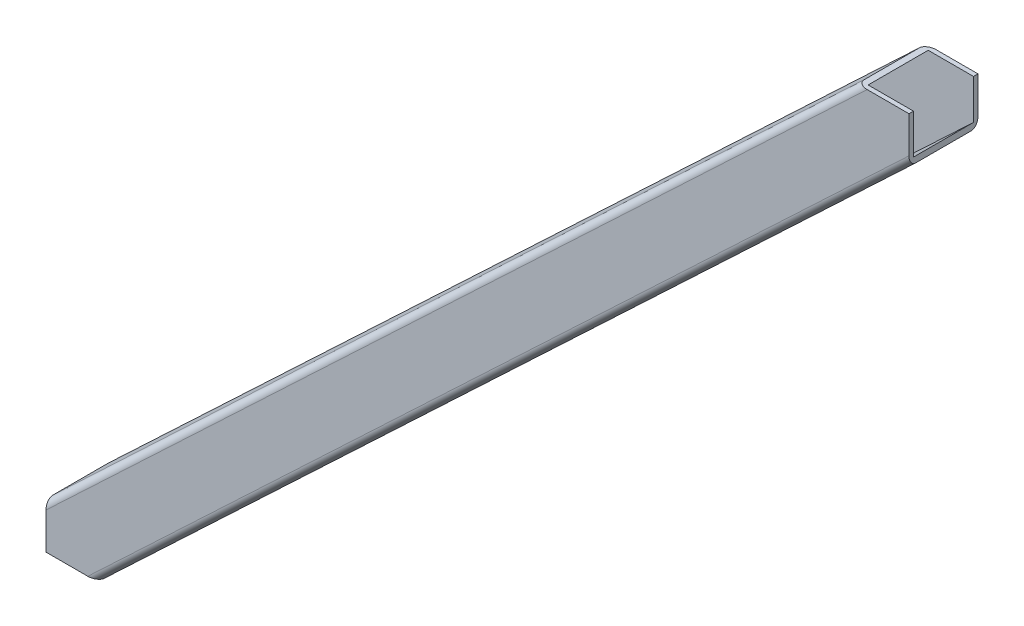
ISO-10303-21;
HEADER;
FILE_DESCRIPTION(('STEP AP214'),'2;1');
FILE_NAME('part.step','',(''),(''),'','','');
FILE_SCHEMA(('AUTOMOTIVE_DESIGN { 1 0 10303 214 1 1 1 1 }'));
ENDSEC;
DATA;
#1=APPLICATION_CONTEXT('core data for automotive mechanical design processes');
#2=APPLICATION_PROTOCOL_DEFINITION('international standard','automotive_design',2000,#1);
#3=PRODUCT_CONTEXT('',#1,'mechanical');
#4=PRODUCT('Part','Part','',(#3));
#5=PRODUCT_RELATED_PRODUCT_CATEGORY('part','',(#4));
#6=PRODUCT_DEFINITION_FORMATION('','',#4);
#7=PRODUCT_DEFINITION_CONTEXT('part definition',#1,'design');
#8=PRODUCT_DEFINITION('design','',#6,#7);
#9=PRODUCT_DEFINITION_SHAPE('','',#8);
#10=(LENGTH_UNIT() NAMED_UNIT(*) SI_UNIT(.MILLI.,.METRE.));
#11=(NAMED_UNIT(*) PLANE_ANGLE_UNIT() SI_UNIT($,.RADIAN.));
#12=(NAMED_UNIT(*) SI_UNIT($,.STERADIAN.) SOLID_ANGLE_UNIT());
#13=UNCERTAINTY_MEASURE_WITH_UNIT(LENGTH_MEASURE(1.E-05),#10,'distance_accuracy_value','');
#14=(GEOMETRIC_REPRESENTATION_CONTEXT(3) GLOBAL_UNCERTAINTY_ASSIGNED_CONTEXT((#13)) GLOBAL_UNIT_ASSIGNED_CONTEXT((#10,
#11,#12)) REPRESENTATION_CONTEXT('',''));
#15=CARTESIAN_POINT('',(0.,0.,0.));
#16=DIRECTION('',(0.,0.,1.));
#17=DIRECTION('',(1.,0.,0.));
#18=AXIS2_PLACEMENT_3D('',#15,#16,#17);
#19=CARTESIAN_POINT('',(159.560000578424,474.43889938687,1453.261));
#20=DIRECTION('',(0.,0.,-1.));
#21=DIRECTION('',(-1.,0.,0.));
#22=AXIS2_PLACEMENT_3D('',#19,#20,#21);
#23=PLANE('',#22);
#24=DIRECTION('',(1.,0.,0.));
#25=VECTOR('',#24,1.);
#26=CARTESIAN_POINT('',(-171.45,157.226,1453.261));
#27=LINE('',#26,#25);
#28=CARTESIAN_POINT('',(-158.75,157.226,1453.261));
#29=VERTEX_POINT('',#28);
#30=CARTESIAN_POINT('',(-143.372761782674,157.226,1453.261));
#31=VERTEX_POINT('',#30);
#32=EDGE_CURVE('E186',#29,#31,#27,.T.);
#33=ORIENTED_EDGE('',*,*,#32,.T.);
#34=DIRECTION('',(-0.727393652509463,-0.686220426895719,0.));
#35=VECTOR('',#34,1.);
#36=CARTESIAN_POINT('',(175.24699953726,457.810680490504,1453.261));
#37=LINE('',#36,#35);
#38=CARTESIAN_POINT('',(158.75,442.247473379881,1453.261));
#39=VERTEX_POINT('',#38);
#40=EDGE_CURVE('E11',#31,#39,#37,.F.);
#41=ORIENTED_EDGE('',*,*,#40,.T.);
#42=DIRECTION('',(0.,-1.,0.));
#43=VECTOR('',#42,1.);
#44=CARTESIAN_POINT('',(158.75,474.43889938687,1453.261));
#45=LINE('',#44,#43);
#46=CARTESIAN_POINT('',(158.75,455.676,1453.261));
#47=VERTEX_POINT('',#46);
#48=EDGE_CURVE('E286',#47,#39,#45,.T.);
#49=ORIENTED_EDGE('',*,*,#48,.F.);
#50=DIRECTION('',(-1.,0.,0.));
#51=VECTOR('',#50,1.);
#52=CARTESIAN_POINT('',(171.45,455.676,1453.261));
#53=LINE('',#52,#51);
#54=CARTESIAN_POINT('',(143.372761782674,455.676,1453.261));
#55=VERTEX_POINT('',#54);
#56=EDGE_CURVE('E204',#47,#55,#53,.T.);
#57=ORIENTED_EDGE('',*,*,#56,.T.);
#58=DIRECTION('',(-0.727393652509463,-0.686220426895719,0.));
#59=VECTOR('',#58,1.);
#60=CARTESIAN_POINT('',(161.303000462739,472.591319509496,1453.261));
#61=LINE('',#60,#59);
#62=CARTESIAN_POINT('',(-158.75,170.654526620119,1453.261));
#63=VERTEX_POINT('',#62);
#64=EDGE_CURVE('E52',#55,#63,#61,.T.);
#65=ORIENTED_EDGE('',*,*,#64,.T.);
#66=DIRECTION('',(0.,1.,0.));
#67=VECTOR('',#66,1.);
#68=CARTESIAN_POINT('',(-158.75,474.43889938687,1453.261));
#69=LINE('',#68,#67);
#70=EDGE_CURVE('E282',#29,#63,#69,.T.);
#71=ORIENTED_EDGE('',*,*,#70,.F.);
#72=EDGE_LOOP('',(#33,#41,#49,#57,#65,#71));
#73=FACE_BOUND('',#72,.T.);
#74=ADVANCED_FACE('F43',(#73),#23,.F.);
#75=CARTESIAN_POINT('',(159.560000578424,474.43889938687,1427.861));
#76=DIRECTION('',(0.686220426895719,-0.727393652509463,0.));
#77=DIRECTION('',(0.727393652509463,0.686220426895719,0.));
#78=AXIS2_PLACEMENT_3D('',#75,#76,#77);
#79=PLANE('',#78);
#80=DIRECTION('',(0.,0.,1.));
#81=VECTOR('',#80,1.);
#82=CARTESIAN_POINT('',(139.671327228342,455.676,1427.861));
#83=LINE('',#82,#81);
#84=CARTESIAN_POINT('',(139.671327228342,455.676,1430.401));
#85=VERTEX_POINT('',#84);
#86=CARTESIAN_POINT('',(139.671327228342,455.676,1450.721));
#87=VERTEX_POINT('',#86);
#88=EDGE_CURVE('E263',#85,#87,#83,.T.);
#89=ORIENTED_EDGE('',*,*,#88,.F.);
#90=DIRECTION('',(-0.727393652509463,-0.686220426895719,0.));
#91=VECTOR('',#90,1.);
#92=CARTESIAN_POINT('',(159.560000578424,474.43889938687,1430.401));
#93=LINE('',#92,#91);
#94=CARTESIAN_POINT('',(-158.75,174.146446010998,1430.401));
#95=VERTEX_POINT('',#94);
#96=EDGE_CURVE('E317',#85,#95,#93,.T.);
#97=ORIENTED_EDGE('',*,*,#96,.T.);
#98=DIRECTION('',(0.,0.,-1.));
#99=VECTOR('',#98,1.);
#100=CARTESIAN_POINT('',(-158.75,174.146446010998,1427.861));
#101=LINE('',#100,#99);
#102=CARTESIAN_POINT('',(-158.75,174.146446010998,1450.721));
#103=VERTEX_POINT('',#102);
#104=EDGE_CURVE('E248',#103,#95,#101,.T.);
#105=ORIENTED_EDGE('',*,*,#104,.F.);
#106=DIRECTION('',(-0.727393652509463,-0.686220426895719,0.));
#107=VECTOR('',#106,1.);
#108=CARTESIAN_POINT('',(159.560000578424,474.43889938687,1450.721));
#109=LINE('',#108,#107);
#110=EDGE_CURVE('E314',#103,#87,#109,.F.);
#111=ORIENTED_EDGE('',*,*,#110,.T.);
#112=EDGE_LOOP('',(#89,#97,#105,#111));
#113=FACE_BOUND('',#112,.T.);
#114=ADVANCED_FACE('F364',(#113),#79,.F.);
#115=CARTESIAN_POINT('',(159.560000578424,474.43889938687,1427.861));
#116=DIRECTION('',(0.,0.,1.));
#117=DIRECTION('',(1.,0.,0.));
#118=AXIS2_PLACEMENT_3D('',#115,#116,#117);
#119=PLANE('',#118);
#120=DIRECTION('',(0.,1.,0.));
#121=VECTOR('',#120,1.);
#122=CARTESIAN_POINT('',(158.75,144.526,1427.861));
#123=LINE('',#122,#121);
#124=CARTESIAN_POINT('',(158.75,442.247473379881,1427.861));
#125=VERTEX_POINT('',#124);
#126=CARTESIAN_POINT('',(158.75,455.676,1427.861));
#127=VERTEX_POINT('',#126);
#128=EDGE_CURVE('E187',#125,#127,#123,.T.);
#129=ORIENTED_EDGE('',*,*,#128,.F.);
#130=DIRECTION('',(-0.727393652509463,-0.686220426895719,0.));
#131=VECTOR('',#130,1.);
#132=CARTESIAN_POINT('',(175.24699953726,457.810680490504,1427.861));
#133=LINE('',#132,#131);
#134=CARTESIAN_POINT('',(-143.372761782674,157.226,1427.861));
#135=VERTEX_POINT('',#134);
#136=EDGE_CURVE('E184',#125,#135,#133,.T.);
#137=ORIENTED_EDGE('',*,*,#136,.T.);
#138=DIRECTION('',(1.,0.,0.));
#139=VECTOR('',#138,1.);
#140=CARTESIAN_POINT('',(-171.45,157.226,1427.861));
#141=LINE('',#140,#139);
#142=CARTESIAN_POINT('',(-158.75,157.226,1427.861));
#143=VERTEX_POINT('',#142);
#144=EDGE_CURVE('E174',#143,#135,#141,.T.);
#145=ORIENTED_EDGE('',*,*,#144,.F.);
#146=DIRECTION('',(0.,-1.,0.));
#147=VECTOR('',#146,1.);
#148=CARTESIAN_POINT('',(-158.75,468.376,1427.861));
#149=LINE('',#148,#147);
#150=CARTESIAN_POINT('',(-158.75,170.654526620119,1427.861));
#151=VERTEX_POINT('',#150);
#152=EDGE_CURVE('E158',#151,#143,#149,.T.);
#153=ORIENTED_EDGE('',*,*,#152,.F.);
#154=DIRECTION('',(-0.727393652509463,-0.686220426895719,0.));
#155=VECTOR('',#154,1.);
#156=CARTESIAN_POINT('',(161.303000462739,472.591319509496,1427.861));
#157=LINE('',#156,#155);
#158=CARTESIAN_POINT('',(143.372761782674,455.676,1427.861));
#159=VERTEX_POINT('',#158);
#160=EDGE_CURVE('E290',#151,#159,#157,.F.);
#161=ORIENTED_EDGE('',*,*,#160,.T.);
#162=DIRECTION('',(-1.,0.,0.));
#163=VECTOR('',#162,1.);
#164=CARTESIAN_POINT('',(171.45,455.676,1427.861));
#165=LINE('',#164,#163);
#166=EDGE_CURVE('E200',#127,#159,#165,.T.);
#167=ORIENTED_EDGE('',*,*,#166,.F.);
#168=EDGE_LOOP('',(#129,#137,#145,#153,#161,#167));
#169=FACE_BOUND('',#168,.T.);
#170=ADVANCED_FACE('F182',(#169),#119,.F.);
#171=CARTESIAN_POINT('',(176.989999421576,455.96310061313,1427.861));
#172=DIRECTION('',(-0.686220426895719,0.727393652509463,0.));
#173=DIRECTION('',(-0.727393652509463,-0.686220426895719,0.));
#174=AXIS2_PLACEMENT_3D('',#171,#172,#173);
#175=PLANE('',#174);
#176=DIRECTION('',(0.,0.,1.));
#177=VECTOR('',#176,1.);
#178=CARTESIAN_POINT('',(-139.671327228342,157.226,1427.861));
#179=LINE('',#178,#177);
#180=CARTESIAN_POINT('',(-139.671327228342,157.226,1430.401));
#181=VERTEX_POINT('',#180);
#182=CARTESIAN_POINT('',(-139.671327228342,157.226,1450.721));
#183=VERTEX_POINT('',#182);
#184=EDGE_CURVE('E217',#181,#183,#179,.T.);
#185=ORIENTED_EDGE('',*,*,#184,.F.);
#186=DIRECTION('',(-0.727393652509463,-0.686220426895719,0.));
#187=VECTOR('',#186,1.);
#188=CARTESIAN_POINT('',(176.989999421576,455.96310061313,1430.401));
#189=LINE('',#188,#187);
#190=CARTESIAN_POINT('',(158.75,438.755553989002,1430.401));
#191=VERTEX_POINT('',#190);
#192=EDGE_CURVE('E305',#181,#191,#189,.F.);
#193=ORIENTED_EDGE('',*,*,#192,.T.);
#194=DIRECTION('',(0.,0.,-1.));
#195=VECTOR('',#194,1.);
#196=CARTESIAN_POINT('',(158.75,438.755553989002,1427.861));
#197=LINE('',#196,#195);
#198=CARTESIAN_POINT('',(158.75,438.755553989002,1450.721));
#199=VERTEX_POINT('',#198);
#200=EDGE_CURVE('E233',#199,#191,#197,.T.);
#201=ORIENTED_EDGE('',*,*,#200,.F.);
#202=DIRECTION('',(-0.727393652509463,-0.686220426895719,0.));
#203=VECTOR('',#202,1.);
#204=CARTESIAN_POINT('',(176.989999421576,455.96310061313,1450.721));
#205=LINE('',#204,#203);
#206=EDGE_CURVE('E301',#199,#183,#205,.T.);
#207=ORIENTED_EDGE('',*,*,#206,.T.);
#208=EDGE_LOOP('',(#185,#193,#201,#207));
#209=FACE_BOUND('',#208,.T.);
#210=ADVANCED_FACE('F350',(#209),#175,.F.);
#211=CARTESIAN_POINT('',(-171.45,157.226,1427.861));
#212=DIRECTION('',(0.,-1.,0.));
#213=DIRECTION('',(0.,0.,-1.));
#214=AXIS2_PLACEMENT_3D('',#211,#212,#213);
#215=PLANE('',#214);
#216=ORIENTED_EDGE('',*,*,#144,.T.);
#217=CARTESIAN_POINT('',(-143.372761782674,157.226,1430.401));
#218=DIRECTION('',(0.,-1.,0.));
#219=DIRECTION('',(-1.,0.,0.));
#220=AXIS2_PLACEMENT_3D('',#217,#218,#219);
#221=ELLIPSE('',#220,3.7014345543316,2.54);
#222=EDGE_CURVE('E298',#135,#181,#221,.T.);
#223=ORIENTED_EDGE('',*,*,#222,.T.);
#224=ORIENTED_EDGE('',*,*,#184,.T.);
#225=CARTESIAN_POINT('',(-143.372761782674,157.226,1450.721));
#226=DIRECTION('',(0.,-1.,0.));
#227=DIRECTION('',(-1.,0.,0.));
#228=AXIS2_PLACEMENT_3D('',#225,#226,#227);
#229=ELLIPSE('',#228,3.7014345543316,2.54);
#230=EDGE_CURVE('E295',#183,#31,#229,.T.);
#231=ORIENTED_EDGE('',*,*,#230,.T.);
#232=ORIENTED_EDGE('',*,*,#32,.F.);
#233=DIRECTION('',(0.,0.,1.));
#234=VECTOR('',#233,1.);
#235=CARTESIAN_POINT('',(-158.75,157.226,1427.861));
#236=LINE('',#235,#234);
#237=CARTESIAN_POINT('',(-158.75,157.226,1451.61));
#238=VERTEX_POINT('',#237);
#239=EDGE_CURVE('E178',#238,#29,#236,.T.);
#240=ORIENTED_EDGE('',*,*,#239,.F.);
#241=DIRECTION('',(-1.,0.,0.));
#242=VECTOR('',#241,1.);
#243=CARTESIAN_POINT('',(160.692950503229,157.226,1451.61));
#244=LINE('',#243,#242);
#245=CARTESIAN_POINT('',(-142.077259688657,157.226,1451.61));
#246=VERTEX_POINT('',#245);
#247=EDGE_CURVE('E213',#246,#238,#244,.T.);
#248=ORIENTED_EDGE('',*,*,#247,.F.);
#249=DIRECTION('',(0.,0.,1.));
#250=VECTOR('',#249,1.);
#251=CARTESIAN_POINT('',(-142.077259688657,157.226,1429.512));
#252=LINE('',#251,#250);
#253=CARTESIAN_POINT('',(-142.077259688658,157.226,1429.512));
#254=VERTEX_POINT('',#253);
#255=EDGE_CURVE('E209',#254,#246,#252,.T.);
#256=ORIENTED_EDGE('',*,*,#255,.F.);
#257=DIRECTION('',(1.,0.,0.));
#258=VECTOR('',#257,1.);
#259=CARTESIAN_POINT('',(160.692950503229,157.226,1429.512));
#260=LINE('',#259,#258);
#261=CARTESIAN_POINT('',(-158.75,157.226,1429.512));
#262=VERTEX_POINT('',#261);
#263=EDGE_CURVE('E176',#262,#254,#260,.T.);
#264=ORIENTED_EDGE('',*,*,#263,.F.);
#265=EDGE_CURVE('E162',#143,#262,#236,.T.);
#266=ORIENTED_EDGE('',*,*,#265,.F.);
#267=EDGE_LOOP('',(#216,#223,#224,#231,#232,#240,#248,#256,#264,#266));
#268=FACE_BOUND('',#267,.T.);
#269=ADVANCED_FACE('F173',(#268),#215,.T.);
#270=CARTESIAN_POINT('',(-158.75,468.376,1427.861));
#271=DIRECTION('',(-1.,0.,0.));
#272=DIRECTION('',(0.,0.,1.));
#273=AXIS2_PLACEMENT_3D('',#270,#271,#272);
#274=PLANE('',#273);
#275=ORIENTED_EDGE('',*,*,#104,.T.);
#276=CARTESIAN_POINT('',(-158.75,170.654526620119,1430.401));
#277=DIRECTION('',(-1.,0.,0.));
#278=DIRECTION('',(0.,-1.,0.));
#279=AXIS2_PLACEMENT_3D('',#276,#277,#278);
#280=ELLIPSE('',#279,3.49191939087887,2.54);
#281=EDGE_CURVE('E164',#95,#151,#280,.T.);
#282=ORIENTED_EDGE('',*,*,#281,.T.);
#283=ORIENTED_EDGE('',*,*,#152,.T.);
#284=ORIENTED_EDGE('',*,*,#265,.T.);
#285=DIRECTION('',(0.,-1.,0.));
#286=VECTOR('',#285,1.);
#287=CARTESIAN_POINT('',(-158.75,473.237972466577,1429.512));
#288=LINE('',#287,#286);
#289=CARTESIAN_POINT('',(-158.75,171.876698406927,1429.512));
#290=VERTEX_POINT('',#289);
#291=EDGE_CURVE('E237',#290,#262,#288,.T.);
#292=ORIENTED_EDGE('',*,*,#291,.F.);
#293=DIRECTION('',(0.,0.,-1.));
#294=VECTOR('',#293,1.);
#295=CARTESIAN_POINT('',(-158.75,171.876698406927,1429.512));
#296=LINE('',#295,#294);
#297=CARTESIAN_POINT('',(-158.75,171.876698406927,1451.61));
#298=VERTEX_POINT('',#297);
#299=EDGE_CURVE('E240',#298,#290,#296,.T.);
#300=ORIENTED_EDGE('',*,*,#299,.F.);
#301=DIRECTION('',(0.,1.,0.));
#302=VECTOR('',#301,1.);
#303=CARTESIAN_POINT('',(-158.75,473.237972466577,1451.61));
#304=LINE('',#303,#302);
#305=EDGE_CURVE('E244',#238,#298,#304,.T.);
#306=ORIENTED_EDGE('',*,*,#305,.F.);
#307=ORIENTED_EDGE('',*,*,#239,.T.);
#308=ORIENTED_EDGE('',*,*,#70,.T.);
#309=CARTESIAN_POINT('',(-158.75,170.654526620119,1450.721));
#310=DIRECTION('',(-1.,0.,0.));
#311=DIRECTION('',(0.,-1.,0.));
#312=AXIS2_PLACEMENT_3D('',#309,#310,#311);
#313=ELLIPSE('',#312,3.49191939087887,2.54);
#314=EDGE_CURVE('E67',#63,#103,#313,.T.);
#315=ORIENTED_EDGE('',*,*,#314,.T.);
#316=EDGE_LOOP('',(#275,#282,#283,#284,#292,#300,#306,#307,#308,#315));
#317=FACE_BOUND('',#316,.T.);
#318=ADVANCED_FACE('F161',(#317),#274,.T.);
#319=CARTESIAN_POINT('',(158.75,144.526,1427.861));
#320=DIRECTION('',(1.,0.,0.));
#321=DIRECTION('',(0.,0.,-1.));
#322=AXIS2_PLACEMENT_3D('',#319,#320,#321);
#323=PLANE('',#322);
#324=ORIENTED_EDGE('',*,*,#200,.T.);
#325=CARTESIAN_POINT('',(158.75,442.247473379881,1430.401));
#326=DIRECTION('',(1.,0.,0.));
#327=DIRECTION('',(0.,-1.,0.));
#328=AXIS2_PLACEMENT_3D('',#325,#326,#327);
#329=ELLIPSE('',#328,3.49191939087887,2.54);
#330=EDGE_CURVE('E311',#191,#125,#329,.T.);
#331=ORIENTED_EDGE('',*,*,#330,.T.);
#332=ORIENTED_EDGE('',*,*,#128,.T.);
#333=DIRECTION('',(0.,0.,-1.));
#334=VECTOR('',#333,1.);
#335=CARTESIAN_POINT('',(158.75,455.676,1427.861));
#336=LINE('',#335,#334);
#337=CARTESIAN_POINT('',(158.75,455.676,1429.512));
#338=VERTEX_POINT('',#337);
#339=EDGE_CURVE('E169',#338,#127,#336,.T.);
#340=ORIENTED_EDGE('',*,*,#339,.F.);
#341=DIRECTION('',(0.,1.,0.));
#342=VECTOR('',#341,1.);
#343=CARTESIAN_POINT('',(158.75,473.237972466577,1429.512));
#344=LINE('',#343,#342);
#345=CARTESIAN_POINT('',(158.75,441.025301593073,1429.512));
#346=VERTEX_POINT('',#345);
#347=EDGE_CURVE('E221',#346,#338,#344,.T.);
#348=ORIENTED_EDGE('',*,*,#347,.F.);
#349=DIRECTION('',(0.,0.,-1.));
#350=VECTOR('',#349,1.);
#351=CARTESIAN_POINT('',(158.75,441.025301593073,1429.512));
#352=LINE('',#351,#350);
#353=CARTESIAN_POINT('',(158.75,441.025301593073,1451.61));
#354=VERTEX_POINT('',#353);
#355=EDGE_CURVE('E225',#354,#346,#352,.T.);
#356=ORIENTED_EDGE('',*,*,#355,.F.);
#357=DIRECTION('',(0.,-1.,0.));
#358=VECTOR('',#357,1.);
#359=CARTESIAN_POINT('',(158.75,473.237972466577,1451.61));
#360=LINE('',#359,#358);
#361=CARTESIAN_POINT('',(158.75,455.676,1451.61));
#362=VERTEX_POINT('',#361);
#363=EDGE_CURVE('E229',#362,#354,#360,.T.);
#364=ORIENTED_EDGE('',*,*,#363,.F.);
#365=EDGE_CURVE('E196',#47,#362,#336,.T.);
#366=ORIENTED_EDGE('',*,*,#365,.F.);
#367=ORIENTED_EDGE('',*,*,#48,.T.);
#368=CARTESIAN_POINT('',(158.75,442.247473379881,1450.721));
#369=DIRECTION('',(1.,0.,0.));
#370=DIRECTION('',(0.,-1.,0.));
#371=AXIS2_PLACEMENT_3D('',#368,#369,#370);
#372=ELLIPSE('',#371,3.49191939087887,2.54);
#373=EDGE_CURVE('E308',#39,#199,#372,.T.);
#374=ORIENTED_EDGE('',*,*,#373,.T.);
#375=EDGE_LOOP('',(#324,#331,#332,#340,#348,#356,#364,#366,#367,#374));
#376=FACE_BOUND('',#375,.T.);
#377=ADVANCED_FACE('F345',(#376),#323,.T.);
#378=CARTESIAN_POINT('',(171.45,455.676,1427.861));
#379=DIRECTION('',(0.,1.,0.));
#380=DIRECTION('',(-1.,0.,0.));
#381=AXIS2_PLACEMENT_3D('',#378,#379,#380);
#382=PLANE('',#381);
#383=ORIENTED_EDGE('',*,*,#166,.T.);
#384=CARTESIAN_POINT('',(143.372761782674,455.676,1430.401));
#385=DIRECTION('',(0.,1.,0.));
#386=DIRECTION('',(-1.,0.,0.));
#387=AXIS2_PLACEMENT_3D('',#384,#385,#386);
#388=ELLIPSE('',#387,3.7014345543316,2.54);
#389=EDGE_CURVE('E327',#159,#85,#388,.T.);
#390=ORIENTED_EDGE('',*,*,#389,.T.);
#391=ORIENTED_EDGE('',*,*,#88,.T.);
#392=CARTESIAN_POINT('',(143.372761782674,455.676,1450.721));
#393=DIRECTION('',(0.,1.,0.));
#394=DIRECTION('',(-1.,0.,0.));
#395=AXIS2_PLACEMENT_3D('',#392,#393,#394);
#396=ELLIPSE('',#395,3.7014345543316,2.54);
#397=EDGE_CURVE('E59',#87,#55,#396,.T.);
#398=ORIENTED_EDGE('',*,*,#397,.T.);
#399=ORIENTED_EDGE('',*,*,#56,.F.);
#400=ORIENTED_EDGE('',*,*,#365,.T.);
#401=DIRECTION('',(1.,0.,0.));
#402=VECTOR('',#401,1.);
#403=CARTESIAN_POINT('',(160.692950503229,455.676,1451.61));
#404=LINE('',#403,#402);
#405=CARTESIAN_POINT('',(142.077259688658,455.676,1451.61));
#406=VERTEX_POINT('',#405);
#407=EDGE_CURVE('E259',#406,#362,#404,.T.);
#408=ORIENTED_EDGE('',*,*,#407,.F.);
#409=DIRECTION('',(0.,0.,1.));
#410=VECTOR('',#409,1.);
#411=CARTESIAN_POINT('',(142.077259688658,455.676,1429.512));
#412=LINE('',#411,#410);
#413=CARTESIAN_POINT('',(142.077259688658,455.676,1429.512));
#414=VERTEX_POINT('',#413);
#415=EDGE_CURVE('E255',#414,#406,#412,.T.);
#416=ORIENTED_EDGE('',*,*,#415,.F.);
#417=DIRECTION('',(-1.,0.,0.));
#418=VECTOR('',#417,1.);
#419=CARTESIAN_POINT('',(160.692950503229,455.676,1429.512));
#420=LINE('',#419,#418);
#421=EDGE_CURVE('E251',#338,#414,#420,.T.);
#422=ORIENTED_EDGE('',*,*,#421,.F.);
#423=ORIENTED_EDGE('',*,*,#339,.T.);
#424=EDGE_LOOP('',(#383,#390,#391,#398,#399,#400,#408,#416,#422,#423));
#425=FACE_BOUND('',#424,.T.);
#426=ADVANCED_FACE('F357',(#425),#382,.T.);
#427=CARTESIAN_POINT('',(160.692950503229,473.237972466577,1429.512));
#428=DIRECTION('',(0.,0.,1.));
#429=DIRECTION('',(1.,0.,0.));
#430=AXIS2_PLACEMENT_3D('',#427,#428,#429);
#431=PLANE('',#430);
#432=ORIENTED_EDGE('',*,*,#347,.T.);
#433=ORIENTED_EDGE('',*,*,#421,.T.);
#434=DIRECTION('',(-0.727393652509463,-0.686220426895719,0.));
#435=VECTOR('',#434,1.);
#436=CARTESIAN_POINT('',(160.692950503229,473.237972466577,1429.512));
#437=LINE('',#436,#435);
#438=EDGE_CURVE('E270',#414,#290,#437,.T.);
#439=ORIENTED_EDGE('',*,*,#438,.T.);
#440=ORIENTED_EDGE('',*,*,#291,.T.);
#441=ORIENTED_EDGE('',*,*,#263,.T.);
#442=DIRECTION('',(-0.727393652509463,-0.686220426895719,0.));
#443=VECTOR('',#442,1.);
#444=CARTESIAN_POINT('',(175.857049496771,457.164027533423,1429.512));
#445=LINE('',#444,#443);
#446=EDGE_CURVE('E266',#346,#254,#445,.T.);
#447=ORIENTED_EDGE('',*,*,#446,.F.);
#448=EDGE_LOOP('',(#432,#433,#439,#440,#441,#447));
#449=FACE_BOUND('',#448,.T.);
#450=ADVANCED_FACE('F384',(#449),#431,.T.);
#451=CARTESIAN_POINT('',(160.692950503229,473.237972466577,1429.512));
#452=DIRECTION('',(0.686220426895719,-0.727393652509463,0.));
#453=DIRECTION('',(0.727393652509463,0.686220426895719,0.));
#454=AXIS2_PLACEMENT_3D('',#451,#452,#453);
#455=PLANE('',#454);
#456=ORIENTED_EDGE('',*,*,#438,.F.);
#457=ORIENTED_EDGE('',*,*,#415,.T.);
#458=DIRECTION('',(-0.727393652509463,-0.686220426895719,0.));
#459=VECTOR('',#458,1.);
#460=CARTESIAN_POINT('',(160.692950503229,473.237972466577,1451.61));
#461=LINE('',#460,#459);
#462=EDGE_CURVE('E274',#406,#298,#461,.T.);
#463=ORIENTED_EDGE('',*,*,#462,.T.);
#464=ORIENTED_EDGE('',*,*,#299,.T.);
#465=EDGE_LOOP('',(#456,#457,#463,#464));
#466=FACE_BOUND('',#465,.T.);
#467=ADVANCED_FACE('F387',(#466),#455,.T.);
#468=CARTESIAN_POINT('',(160.692950503229,473.237972466577,1451.61));
#469=DIRECTION('',(0.,0.,-1.));
#470=DIRECTION('',(-1.,0.,0.));
#471=AXIS2_PLACEMENT_3D('',#468,#469,#470);
#472=PLANE('',#471);
#473=ORIENTED_EDGE('',*,*,#462,.F.);
#474=ORIENTED_EDGE('',*,*,#407,.T.);
#475=ORIENTED_EDGE('',*,*,#363,.T.);
#476=DIRECTION('',(-0.727393652509463,-0.686220426895719,0.));
#477=VECTOR('',#476,1.);
#478=CARTESIAN_POINT('',(175.857049496771,457.164027533423,1451.61));
#479=LINE('',#478,#477);
#480=EDGE_CURVE('E278',#354,#246,#479,.T.);
#481=ORIENTED_EDGE('',*,*,#480,.T.);
#482=ORIENTED_EDGE('',*,*,#247,.T.);
#483=ORIENTED_EDGE('',*,*,#305,.T.);
#484=EDGE_LOOP('',(#473,#474,#475,#481,#482,#483));
#485=FACE_BOUND('',#484,.T.);
#486=ADVANCED_FACE('F391',(#485),#472,.T.);
#487=CARTESIAN_POINT('',(175.857049496771,457.164027533423,1429.512));
#488=DIRECTION('',(-0.686220426895719,0.727393652509463,0.));
#489=DIRECTION('',(-0.727393652509463,-0.686220426895719,0.));
#490=AXIS2_PLACEMENT_3D('',#487,#488,#489);
#491=PLANE('',#490);
#492=ORIENTED_EDGE('',*,*,#480,.F.);
#493=ORIENTED_EDGE('',*,*,#355,.T.);
#494=ORIENTED_EDGE('',*,*,#446,.T.);
#495=ORIENTED_EDGE('',*,*,#255,.T.);
#496=EDGE_LOOP('',(#492,#493,#494,#495));
#497=FACE_BOUND('',#496,.T.);
#498=ADVANCED_FACE('F395',(#497),#491,.T.);
#499=CARTESIAN_POINT('',(175.24699953726,457.810680490504,1430.401));
#500=DIRECTION('',(-0.727393652509463,-0.686220426895719,0.));
#501=DIRECTION('',(0.686220426895719,-0.727393652509463,0.));
#502=AXIS2_PLACEMENT_3D('',#499,#500,#501);
#503=CYLINDRICAL_SURFACE('',#502,2.54);
#504=ORIENTED_EDGE('',*,*,#330,.F.);
#505=ORIENTED_EDGE('',*,*,#192,.F.);
#506=ORIENTED_EDGE('',*,*,#222,.F.);
#507=ORIENTED_EDGE('',*,*,#136,.F.);
#508=EDGE_LOOP('',(#504,#505,#506,#507));
#509=FACE_BOUND('',#508,.T.);
#510=ADVANCED_FACE('F353',(#509),#503,.T.);
#511=CARTESIAN_POINT('',(161.303000462739,472.591319509496,1430.401));
#512=DIRECTION('',(-0.727393652509463,-0.686220426895719,0.));
#513=DIRECTION('',(0.686220426895719,-0.727393652509463,0.));
#514=AXIS2_PLACEMENT_3D('',#511,#512,#513);
#515=CYLINDRICAL_SURFACE('',#514,2.54);
#516=ORIENTED_EDGE('',*,*,#389,.F.);
#517=ORIENTED_EDGE('',*,*,#160,.F.);
#518=ORIENTED_EDGE('',*,*,#281,.F.);
#519=ORIENTED_EDGE('',*,*,#96,.F.);
#520=EDGE_LOOP('',(#516,#517,#518,#519));
#521=FACE_BOUND('',#520,.T.);
#522=ADVANCED_FACE('F362',(#521),#515,.T.);
#523=CARTESIAN_POINT('',(175.24699953726,457.810680490504,1450.721));
#524=DIRECTION('',(-0.727393652509463,-0.686220426895719,0.));
#525=DIRECTION('',(0.686220426895719,-0.727393652509463,0.));
#526=AXIS2_PLACEMENT_3D('',#523,#524,#525);
#527=CYLINDRICAL_SURFACE('',#526,2.54);
#528=ORIENTED_EDGE('',*,*,#373,.F.);
#529=ORIENTED_EDGE('',*,*,#40,.F.);
#530=ORIENTED_EDGE('',*,*,#230,.F.);
#531=ORIENTED_EDGE('',*,*,#206,.F.);
#532=EDGE_LOOP('',(#528,#529,#530,#531));
#533=FACE_BOUND('',#532,.T.);
#534=ADVANCED_FACE('F341',(#533),#527,.T.);
#535=CARTESIAN_POINT('',(161.303000462739,472.591319509496,1450.721));
#536=DIRECTION('',(-0.727393652509463,-0.686220426895719,0.));
#537=DIRECTION('',(0.686220426895719,-0.727393652509463,0.));
#538=AXIS2_PLACEMENT_3D('',#535,#536,#537);
#539=CYLINDRICAL_SURFACE('',#538,2.54);
#540=ORIENTED_EDGE('',*,*,#397,.F.);
#541=ORIENTED_EDGE('',*,*,#110,.F.);
#542=ORIENTED_EDGE('',*,*,#314,.F.);
#543=ORIENTED_EDGE('',*,*,#64,.F.);
#544=EDGE_LOOP('',(#540,#541,#542,#543));
#545=FACE_BOUND('',#544,.T.);
#546=ADVANCED_FACE('F45',(#545),#539,.T.);
#547=CLOSED_SHELL('',(#74,#114,#170,#210,#269,#318,#377,#426,#450,#467,#486,#498,#510,#522,#534,#546));
#548=MANIFOLD_SOLID_BREP('B2',#547);
#549=ADVANCED_BREP_SHAPE_REPRESENTATION('',(#18,#548),#14);
#550=SHAPE_DEFINITION_REPRESENTATION(#9,#549);
ENDSEC;
END-ISO-10303-21;
